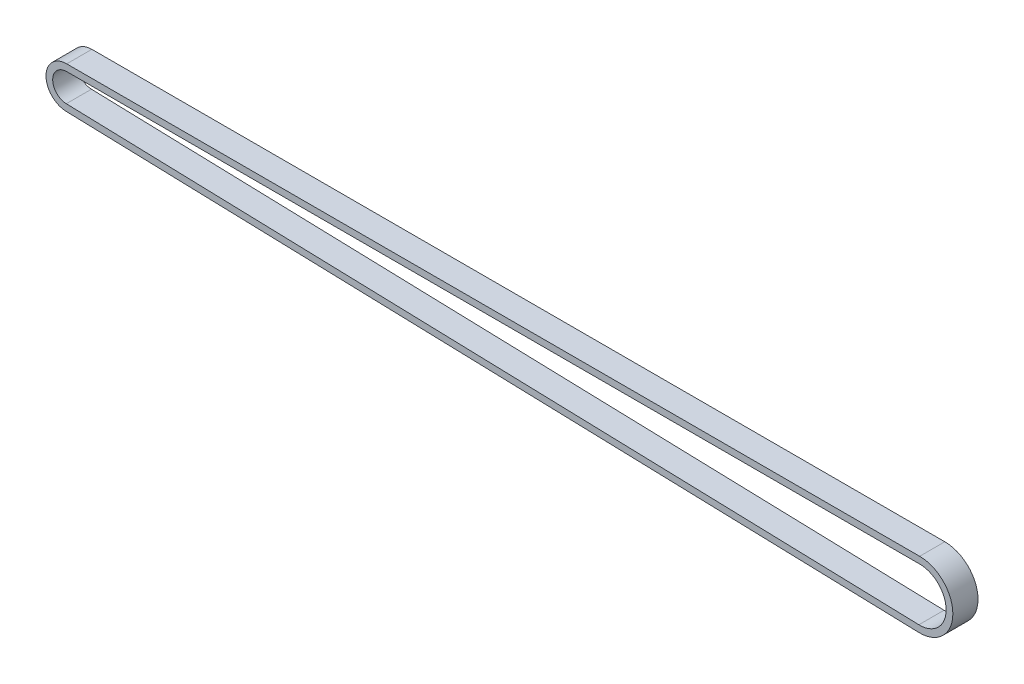
ISO-10303-21;
HEADER;
FILE_DESCRIPTION(('STEP AP214'),'2;1');
FILE_NAME('part.step','',(''),(''),'','','');
FILE_SCHEMA(('AUTOMOTIVE_DESIGN { 1 0 10303 214 1 1 1 1 }'));
ENDSEC;
DATA;
#1=APPLICATION_CONTEXT('core data for automotive mechanical design processes');
#2=APPLICATION_PROTOCOL_DEFINITION('international standard','automotive_design',2000,#1);
#3=PRODUCT_CONTEXT('',#1,'mechanical');
#4=PRODUCT('Part','Part','',(#3));
#5=PRODUCT_RELATED_PRODUCT_CATEGORY('part','',(#4));
#6=PRODUCT_DEFINITION_FORMATION('','',#4);
#7=PRODUCT_DEFINITION_CONTEXT('part definition',#1,'design');
#8=PRODUCT_DEFINITION('design','',#6,#7);
#9=PRODUCT_DEFINITION_SHAPE('','',#8);
#10=(LENGTH_UNIT() NAMED_UNIT(*) SI_UNIT(.MILLI.,.METRE.));
#11=(NAMED_UNIT(*) PLANE_ANGLE_UNIT() SI_UNIT($,.RADIAN.));
#12=(NAMED_UNIT(*) SI_UNIT($,.STERADIAN.) SOLID_ANGLE_UNIT());
#13=UNCERTAINTY_MEASURE_WITH_UNIT(LENGTH_MEASURE(1.E-05),#10,'distance_accuracy_value','');
#14=(GEOMETRIC_REPRESENTATION_CONTEXT(3) GLOBAL_UNCERTAINTY_ASSIGNED_CONTEXT((#13)) GLOBAL_UNIT_ASSIGNED_CONTEXT((#10,
#11,#12)) REPRESENTATION_CONTEXT('',''));
#15=CARTESIAN_POINT('',(0.,0.,0.));
#16=DIRECTION('',(0.,0.,1.));
#17=DIRECTION('',(1.,0.,0.));
#18=AXIS2_PLACEMENT_3D('',#15,#16,#17);
#19=CARTESIAN_POINT('',(0.,0.,9.525));
#20=DIRECTION('',(0.,0.,1.));
#21=DIRECTION('',(1.,0.,0.));
#22=AXIS2_PLACEMENT_3D('',#19,#20,#21);
#23=PLANE('',#22);
#24=CARTESIAN_POINT('',(0.,0.,9.525));
#25=DIRECTION('',(0.,0.,1.));
#26=DIRECTION('',(1.,0.,0.));
#27=AXIS2_PLACEMENT_3D('',#24,#25,#26);
#28=CIRCLE('',#27,7.8486);
#29=CARTESIAN_POINT('',(0.,7.8486,9.525));
#30=VERTEX_POINT('',#29);
#31=CARTESIAN_POINT('',(-0.229572502923176,-7.84524176975455,9.525));
#32=VERTEX_POINT('',#31);
#33=EDGE_CURVE('E134',#30,#32,#28,.T.);
#34=ORIENTED_EDGE('',*,*,#33,.T.);
#35=DIRECTION('',(0.999572123659577,-0.0292501214131407,0.));
#36=VECTOR('',#35,1.);
#37=CARTESIAN_POINT('',(-0.229572502923176,-7.84524176975455,9.525));
#38=LINE('',#37,#36);
#39=CARTESIAN_POINT('',(322.597685360841,-17.2920203107719,9.525));
#40=VERTEX_POINT('',#39);
#41=EDGE_CURVE('E137',#32,#40,#38,.T.);
#42=ORIENTED_EDGE('',*,*,#41,.T.);
#43=CARTESIAN_POINT('',(322.965447137368,-4.7244,9.525));
#44=DIRECTION('',(0.,0.,1.));
#45=DIRECTION('',(1.,0.,0.));
#46=AXIS2_PLACEMENT_3D('',#43,#44,#45);
#47=CIRCLE('',#46,12.573);
#48=CARTESIAN_POINT('',(322.965447137368,7.8486,9.525));
#49=VERTEX_POINT('',#48);
#50=EDGE_CURVE('E140',#40,#49,#47,.T.);
#51=ORIENTED_EDGE('',*,*,#50,.T.);
#52=DIRECTION('',(-1.,0.,0.));
#53=VECTOR('',#52,1.);
#54=CARTESIAN_POINT('',(0.,7.8486,9.525));
#55=LINE('',#54,#53);
#56=EDGE_CURVE('E142',#49,#30,#55,.T.);
#57=ORIENTED_EDGE('',*,*,#56,.T.);
#58=EDGE_LOOP('',(#34,#42,#51,#57));
#59=FACE_BOUND('',#58,.T.);
#60=DIRECTION('',(0.999572123659577,-0.0292501214131408,0.));
#61=VECTOR('',#60,1.);
#62=CARTESIAN_POINT('',(-0.155277194533799,-5.30632857565923,9.525));
#63=LINE('',#62,#61);
#64=CARTESIAN_POINT('',(-0.155277194533799,-5.30632857565923,9.525));
#65=VERTEX_POINT('',#64);
#66=CARTESIAN_POINT('',(322.67198066923,-14.7531071166765,9.525));
#67=VERTEX_POINT('',#66);
#68=EDGE_CURVE('E106',#65,#67,#63,.T.);
#69=ORIENTED_EDGE('',*,*,#68,.F.);
#70=CARTESIAN_POINT('',(0.,0.,9.525));
#71=DIRECTION('',(0.,0.,1.));
#72=DIRECTION('',(1.,0.,0.));
#73=AXIS2_PLACEMENT_3D('',#70,#71,#72);
#74=CIRCLE('',#73,5.3086);
#75=CARTESIAN_POINT('',(0.,5.3086,9.525));
#76=VERTEX_POINT('',#75);
#77=EDGE_CURVE('E98',#76,#65,#74,.T.);
#78=ORIENTED_EDGE('',*,*,#77,.F.);
#79=DIRECTION('',(-1.,0.,0.));
#80=VECTOR('',#79,1.);
#81=CARTESIAN_POINT('',(0.,5.3086,9.525));
#82=LINE('',#81,#80);
#83=CARTESIAN_POINT('',(322.965447137368,5.3086,9.525));
#84=VERTEX_POINT('',#83);
#85=EDGE_CURVE('E120',#84,#76,#82,.T.);
#86=ORIENTED_EDGE('',*,*,#85,.F.);
#87=CARTESIAN_POINT('',(322.965447137368,-4.7244,9.525));
#88=DIRECTION('',(0.,0.,1.));
#89=DIRECTION('',(1.,0.,0.));
#90=AXIS2_PLACEMENT_3D('',#87,#88,#89);
#91=CIRCLE('',#90,10.033);
#92=EDGE_CURVE('E118',#67,#84,#91,.T.);
#93=ORIENTED_EDGE('',*,*,#92,.F.);
#94=EDGE_LOOP('',(#69,#78,#86,#93));
#95=FACE_BOUND('',#94,.T.);
#96=ADVANCED_FACE('F33',(#59,#95),#23,.T.);
#97=CARTESIAN_POINT('',(0.,0.,0.));
#98=DIRECTION('',(0.,0.,1.));
#99=DIRECTION('',(1.,0.,0.));
#100=AXIS2_PLACEMENT_3D('',#97,#98,#99);
#101=PLANE('',#100);
#102=CARTESIAN_POINT('',(0.,0.,0.));
#103=DIRECTION('',(0.,0.,1.));
#104=DIRECTION('',(1.,0.,0.));
#105=AXIS2_PLACEMENT_3D('',#102,#103,#104);
#106=CIRCLE('',#105,7.8486);
#107=CARTESIAN_POINT('',(0.,7.8486,0.));
#108=VERTEX_POINT('',#107);
#109=CARTESIAN_POINT('',(-0.229572502923176,-7.84524176975455,0.));
#110=VERTEX_POINT('',#109);
#111=EDGE_CURVE('E114',#108,#110,#106,.T.);
#112=ORIENTED_EDGE('',*,*,#111,.F.);
#113=DIRECTION('',(-1.,0.,0.));
#114=VECTOR('',#113,1.);
#115=CARTESIAN_POINT('',(0.,7.8486,0.));
#116=LINE('',#115,#114);
#117=CARTESIAN_POINT('',(322.965447137368,7.8486,0.));
#118=VERTEX_POINT('',#117);
#119=EDGE_CURVE('E138',#118,#108,#116,.T.);
#120=ORIENTED_EDGE('',*,*,#119,.F.);
#121=CARTESIAN_POINT('',(322.965447137368,-4.7244,0.));
#122=DIRECTION('',(0.,0.,1.));
#123=DIRECTION('',(1.,0.,0.));
#124=AXIS2_PLACEMENT_3D('',#121,#122,#123);
#125=CIRCLE('',#124,12.573);
#126=CARTESIAN_POINT('',(322.597685360841,-17.2920203107719,0.));
#127=VERTEX_POINT('',#126);
#128=EDGE_CURVE('E149',#127,#118,#125,.T.);
#129=ORIENTED_EDGE('',*,*,#128,.F.);
#130=DIRECTION('',(0.999572123659577,-0.0292501214131407,0.));
#131=VECTOR('',#130,1.);
#132=CARTESIAN_POINT('',(-0.229572502923176,-7.84524176975455,0.));
#133=LINE('',#132,#131);
#134=EDGE_CURVE('E147',#110,#127,#133,.T.);
#135=ORIENTED_EDGE('',*,*,#134,.F.);
#136=EDGE_LOOP('',(#112,#120,#129,#135));
#137=FACE_BOUND('',#136,.T.);
#138=CARTESIAN_POINT('',(0.,0.,0.));
#139=DIRECTION('',(0.,0.,1.));
#140=DIRECTION('',(1.,0.,0.));
#141=AXIS2_PLACEMENT_3D('',#138,#139,#140);
#142=CIRCLE('',#141,5.3086);
#143=CARTESIAN_POINT('',(0.,5.3086,0.));
#144=VERTEX_POINT('',#143);
#145=CARTESIAN_POINT('',(-0.155277194533799,-5.30632857565923,0.));
#146=VERTEX_POINT('',#145);
#147=EDGE_CURVE('E56',#144,#146,#142,.T.);
#148=ORIENTED_EDGE('',*,*,#147,.T.);
#149=DIRECTION('',(0.999572123659577,-0.0292501214131408,0.));
#150=VECTOR('',#149,1.);
#151=CARTESIAN_POINT('',(-0.155277194533799,-5.30632857565923,0.));
#152=LINE('',#151,#150);
#153=CARTESIAN_POINT('',(322.67198066923,-14.7531071166765,0.));
#154=VERTEX_POINT('',#153);
#155=EDGE_CURVE('E113',#146,#154,#152,.T.);
#156=ORIENTED_EDGE('',*,*,#155,.T.);
#157=CARTESIAN_POINT('',(322.965447137368,-4.7244,0.));
#158=DIRECTION('',(0.,0.,1.));
#159=DIRECTION('',(1.,0.,0.));
#160=AXIS2_PLACEMENT_3D('',#157,#158,#159);
#161=CIRCLE('',#160,10.033);
#162=CARTESIAN_POINT('',(322.965447137368,5.3086,0.));
#163=VERTEX_POINT('',#162);
#164=EDGE_CURVE('E126',#154,#163,#161,.T.);
#165=ORIENTED_EDGE('',*,*,#164,.T.);
#166=DIRECTION('',(-1.,0.,0.));
#167=VECTOR('',#166,1.);
#168=CARTESIAN_POINT('',(0.,5.3086,0.));
#169=LINE('',#168,#167);
#170=EDGE_CURVE('E107',#163,#144,#169,.T.);
#171=ORIENTED_EDGE('',*,*,#170,.T.);
#172=EDGE_LOOP('',(#148,#156,#165,#171));
#173=FACE_BOUND('',#172,.T.);
#174=ADVANCED_FACE('F167',(#137,#173),#101,.F.);
#175=CARTESIAN_POINT('',(0.,0.,9.525));
#176=DIRECTION('',(0.,0.,-1.));
#177=DIRECTION('',(-1.,0.,0.));
#178=AXIS2_PLACEMENT_3D('',#175,#176,#177);
#179=CYLINDRICAL_SURFACE('',#178,7.8486);
#180=ORIENTED_EDGE('',*,*,#111,.T.);
#181=DIRECTION('',(0.,0.,-1.));
#182=VECTOR('',#181,1.);
#183=CARTESIAN_POINT('',(-0.229572502923176,-7.84524176975455,9.525));
#184=LINE('',#183,#182);
#185=EDGE_CURVE('E11',#32,#110,#184,.T.);
#186=ORIENTED_EDGE('',*,*,#185,.F.);
#187=ORIENTED_EDGE('',*,*,#33,.F.);
#188=DIRECTION('',(0.,0.,-1.));
#189=VECTOR('',#188,1.);
#190=CARTESIAN_POINT('',(0.,7.8486,9.525));
#191=LINE('',#190,#189);
#192=EDGE_CURVE('E144',#30,#108,#191,.T.);
#193=ORIENTED_EDGE('',*,*,#192,.T.);
#194=EDGE_LOOP('',(#180,#186,#187,#193));
#195=FACE_BOUND('',#194,.T.);
#196=ADVANCED_FACE('F35',(#195),#179,.T.);
#197=CARTESIAN_POINT('',(-0.229572502923176,-7.84524176975455,9.525));
#198=DIRECTION('',(0.0292501214131407,0.999572123659577,0.));
#199=DIRECTION('',(-0.999572123659577,0.0292501214131407,0.));
#200=AXIS2_PLACEMENT_3D('',#197,#198,#199);
#201=PLANE('',#200);
#202=ORIENTED_EDGE('',*,*,#134,.T.);
#203=DIRECTION('',(0.,0.,-1.));
#204=VECTOR('',#203,1.);
#205=CARTESIAN_POINT('',(322.597685360841,-17.2920203107719,9.525));
#206=LINE('',#205,#204);
#207=EDGE_CURVE('E41',#40,#127,#206,.T.);
#208=ORIENTED_EDGE('',*,*,#207,.F.);
#209=ORIENTED_EDGE('',*,*,#41,.F.);
#210=ORIENTED_EDGE('',*,*,#185,.T.);
#211=EDGE_LOOP('',(#202,#208,#209,#210));
#212=FACE_BOUND('',#211,.T.);
#213=ADVANCED_FACE('F177',(#212),#201,.F.);
#214=CARTESIAN_POINT('',(322.965447137368,-4.7244,9.525));
#215=DIRECTION('',(0.,0.,-1.));
#216=DIRECTION('',(-1.,0.,0.));
#217=AXIS2_PLACEMENT_3D('',#214,#215,#216);
#218=CYLINDRICAL_SURFACE('',#217,12.573);
#219=ORIENTED_EDGE('',*,*,#128,.T.);
#220=DIRECTION('',(0.,0.,-1.));
#221=VECTOR('',#220,1.);
#222=CARTESIAN_POINT('',(322.965447137368,7.8486,9.525));
#223=LINE('',#222,#221);
#224=EDGE_CURVE('E154',#49,#118,#223,.T.);
#225=ORIENTED_EDGE('',*,*,#224,.F.);
#226=ORIENTED_EDGE('',*,*,#50,.F.);
#227=ORIENTED_EDGE('',*,*,#207,.T.);
#228=EDGE_LOOP('',(#219,#225,#226,#227));
#229=FACE_BOUND('',#228,.T.);
#230=ADVANCED_FACE('F161',(#229),#218,.T.);
#231=CARTESIAN_POINT('',(0.,7.8486,9.525));
#232=DIRECTION('',(0.,-1.,0.));
#233=DIRECTION('',(0.,0.,-1.));
#234=AXIS2_PLACEMENT_3D('',#231,#232,#233);
#235=PLANE('',#234);
#236=ORIENTED_EDGE('',*,*,#119,.T.);
#237=ORIENTED_EDGE('',*,*,#192,.F.);
#238=ORIENTED_EDGE('',*,*,#56,.F.);
#239=ORIENTED_EDGE('',*,*,#224,.T.);
#240=EDGE_LOOP('',(#236,#237,#238,#239));
#241=FACE_BOUND('',#240,.T.);
#242=ADVANCED_FACE('F171',(#241),#235,.F.);
#243=CARTESIAN_POINT('',(0.,0.,9.525));
#244=DIRECTION('',(0.,0.,-1.));
#245=DIRECTION('',(-1.,0.,0.));
#246=AXIS2_PLACEMENT_3D('',#243,#244,#245);
#247=CYLINDRICAL_SURFACE('',#246,5.3086);
#248=ORIENTED_EDGE('',*,*,#147,.F.);
#249=DIRECTION('',(0.,0.,-1.));
#250=VECTOR('',#249,1.);
#251=CARTESIAN_POINT('',(0.,5.3086,9.525));
#252=LINE('',#251,#250);
#253=EDGE_CURVE('E102',#76,#144,#252,.T.);
#254=ORIENTED_EDGE('',*,*,#253,.F.);
#255=ORIENTED_EDGE('',*,*,#77,.T.);
#256=DIRECTION('',(0.,0.,-1.));
#257=VECTOR('',#256,1.);
#258=CARTESIAN_POINT('',(-0.155277194533799,-5.30632857565923,9.525));
#259=LINE('',#258,#257);
#260=EDGE_CURVE('E101',#65,#146,#259,.T.);
#261=ORIENTED_EDGE('',*,*,#260,.T.);
#262=EDGE_LOOP('',(#248,#254,#255,#261));
#263=FACE_BOUND('',#262,.T.);
#264=ADVANCED_FACE('F100',(#263),#247,.F.);
#265=CARTESIAN_POINT('',(-0.155277194533799,-5.30632857565923,9.525));
#266=DIRECTION('',(0.0292501214131408,0.999572123659577,0.));
#267=DIRECTION('',(-0.999572123659577,0.0292501214131408,0.));
#268=AXIS2_PLACEMENT_3D('',#265,#266,#267);
#269=PLANE('',#268);
#270=ORIENTED_EDGE('',*,*,#155,.F.);
#271=ORIENTED_EDGE('',*,*,#260,.F.);
#272=ORIENTED_EDGE('',*,*,#68,.T.);
#273=DIRECTION('',(0.,0.,-1.));
#274=VECTOR('',#273,1.);
#275=CARTESIAN_POINT('',(322.67198066923,-14.7531071166765,9.525));
#276=LINE('',#275,#274);
#277=EDGE_CURVE('E115',#67,#154,#276,.T.);
#278=ORIENTED_EDGE('',*,*,#277,.T.);
#279=EDGE_LOOP('',(#270,#271,#272,#278));
#280=FACE_BOUND('',#279,.T.);
#281=ADVANCED_FACE('F110',(#280),#269,.T.);
#282=CARTESIAN_POINT('',(322.965447137368,-4.7244,9.525));
#283=DIRECTION('',(0.,0.,-1.));
#284=DIRECTION('',(-1.,0.,0.));
#285=AXIS2_PLACEMENT_3D('',#282,#283,#284);
#286=CYLINDRICAL_SURFACE('',#285,10.033);
#287=ORIENTED_EDGE('',*,*,#164,.F.);
#288=ORIENTED_EDGE('',*,*,#277,.F.);
#289=ORIENTED_EDGE('',*,*,#92,.T.);
#290=DIRECTION('',(0.,0.,-1.));
#291=VECTOR('',#290,1.);
#292=CARTESIAN_POINT('',(322.965447137368,5.3086,9.525));
#293=LINE('',#292,#291);
#294=EDGE_CURVE('E48',#84,#163,#293,.T.);
#295=ORIENTED_EDGE('',*,*,#294,.T.);
#296=EDGE_LOOP('',(#287,#288,#289,#295));
#297=FACE_BOUND('',#296,.T.);
#298=ADVANCED_FACE('F200',(#297),#286,.F.);
#299=CARTESIAN_POINT('',(0.,5.3086,9.525));
#300=DIRECTION('',(0.,-1.,0.));
#301=DIRECTION('',(0.,0.,-1.));
#302=AXIS2_PLACEMENT_3D('',#299,#300,#301);
#303=PLANE('',#302);
#304=ORIENTED_EDGE('',*,*,#170,.F.);
#305=ORIENTED_EDGE('',*,*,#294,.F.);
#306=ORIENTED_EDGE('',*,*,#85,.T.);
#307=ORIENTED_EDGE('',*,*,#253,.T.);
#308=EDGE_LOOP('',(#304,#305,#306,#307));
#309=FACE_BOUND('',#308,.T.);
#310=ADVANCED_FACE('F204',(#309),#303,.T.);
#311=CLOSED_SHELL('',(#96,#174,#196,#213,#230,#242,#264,#281,#298,#310));
#312=MANIFOLD_SOLID_BREP('B2',#311);
#313=ADVANCED_BREP_SHAPE_REPRESENTATION('',(#18,#312),#14);
#314=SHAPE_DEFINITION_REPRESENTATION(#9,#313);
ENDSEC;
END-ISO-10303-21;
